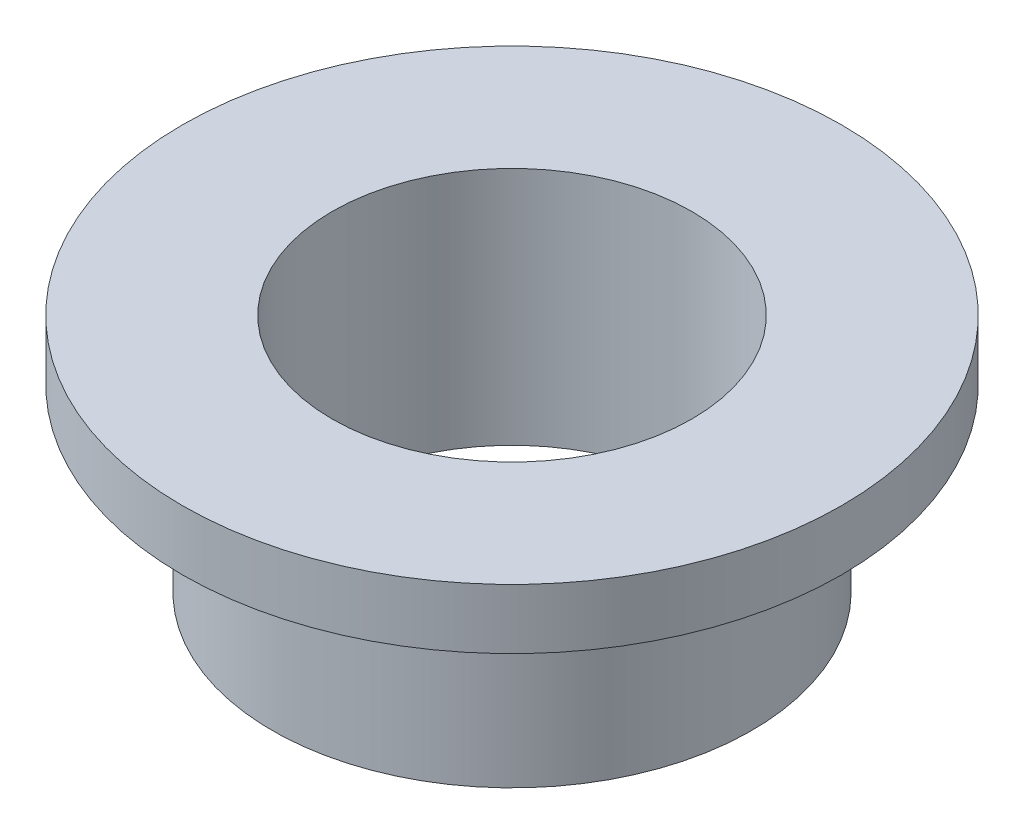
ISO-10303-21;
HEADER;
FILE_DESCRIPTION(('STEP AP214'),'2;1');
FILE_NAME('part.step','',(''),(''),'','','');
FILE_SCHEMA(('AUTOMOTIVE_DESIGN { 1 0 10303 214 1 1 1 1 }'));
ENDSEC;
DATA;
#1=APPLICATION_CONTEXT('core data for automotive mechanical design processes');
#2=APPLICATION_PROTOCOL_DEFINITION('international standard','automotive_design',2000,#1);
#3=PRODUCT_CONTEXT('',#1,'mechanical');
#4=PRODUCT('Part','Part','',(#3));
#5=PRODUCT_RELATED_PRODUCT_CATEGORY('part','',(#4));
#6=PRODUCT_DEFINITION_FORMATION('','',#4);
#7=PRODUCT_DEFINITION_CONTEXT('part definition',#1,'design');
#8=PRODUCT_DEFINITION('design','',#6,#7);
#9=PRODUCT_DEFINITION_SHAPE('','',#8);
#10=(LENGTH_UNIT() NAMED_UNIT(*) SI_UNIT(.MILLI.,.METRE.));
#11=(NAMED_UNIT(*) PLANE_ANGLE_UNIT() SI_UNIT($,.RADIAN.));
#12=(NAMED_UNIT(*) SI_UNIT($,.STERADIAN.) SOLID_ANGLE_UNIT());
#13=UNCERTAINTY_MEASURE_WITH_UNIT(LENGTH_MEASURE(1.E-05),#10,'distance_accuracy_value','');
#14=(GEOMETRIC_REPRESENTATION_CONTEXT(3) GLOBAL_UNCERTAINTY_ASSIGNED_CONTEXT((#13)) GLOBAL_UNIT_ASSIGNED_CONTEXT((#10,
#11,#12)) REPRESENTATION_CONTEXT('',''));
#15=CARTESIAN_POINT('',(0.,0.,0.));
#16=DIRECTION('',(0.,0.,1.));
#17=DIRECTION('',(1.,0.,0.));
#18=AXIS2_PLACEMENT_3D('',#15,#16,#17);
#19=CARTESIAN_POINT('',(0.,0.,0.));
#20=DIRECTION('',(0.,1.,0.));
#21=DIRECTION('',(0.,0.,1.));
#22=AXIS2_PLACEMENT_3D('',#19,#20,#21);
#23=PLANE('',#22);
#24=CARTESIAN_POINT('',(0.,0.,0.));
#25=DIRECTION('',(0.,1.,0.));
#26=DIRECTION('',(0.,0.,1.));
#27=AXIS2_PLACEMENT_3D('',#24,#25,#26);
#28=CIRCLE('',#27,6.35);
#29=CARTESIAN_POINT('',(0.,0.,-6.35));
#30=VERTEX_POINT('',#29);
#31=EDGE_CURVE('E35',#30,#30,#28,.T.);
#32=ORIENTED_EDGE('',*,*,#31,.F.);
#33=EDGE_LOOP('',(#32));
#34=FACE_BOUND('',#33,.T.);
#35=CARTESIAN_POINT('',(0.,0.,0.));
#36=DIRECTION('',(0.,1.,0.));
#37=DIRECTION('',(0.,0.,1.));
#38=AXIS2_PLACEMENT_3D('',#35,#36,#37);
#39=CIRCLE('',#38,4.7625);
#40=CARTESIAN_POINT('',(0.,0.,-4.7625));
#41=VERTEX_POINT('',#40);
#42=EDGE_CURVE('E42',#41,#41,#39,.T.);
#43=ORIENTED_EDGE('',*,*,#42,.T.);
#44=EDGE_LOOP('',(#43));
#45=FACE_BOUND('',#44,.T.);
#46=ADVANCED_FACE('F31',(#34,#45),#23,.F.);
#47=CARTESIAN_POINT('',(0.,4.7625,0.));
#48=DIRECTION('',(0.,-1.,0.));
#49=DIRECTION('',(0.,0.,-1.));
#50=AXIS2_PLACEMENT_3D('',#47,#48,#49);
#51=CYLINDRICAL_SURFACE('',#50,6.35);
#52=CARTESIAN_POINT('',(0.,4.7625,0.));
#53=DIRECTION('',(0.,1.,0.));
#54=DIRECTION('',(0.,0.,1.));
#55=AXIS2_PLACEMENT_3D('',#52,#53,#54);
#56=CIRCLE('',#55,6.35);
#57=CARTESIAN_POINT('',(0.,4.7625,-6.35));
#58=VERTEX_POINT('',#57);
#59=EDGE_CURVE('E10',#58,#58,#56,.T.);
#60=CARTESIAN_POINT('',(0.,4.7625,-6.35));
#61=CARTESIAN_POINT('',(0.,4.712890625,-6.35));
#62=CARTESIAN_POINT('',(0.,4.66328125,-6.35));
#63=CARTESIAN_POINT('',(0.,4.5640625,-6.35));
#64=CARTESIAN_POINT('',(0.,4.514453125,-6.35));
#65=CARTESIAN_POINT('',(0.,4.415234375,-6.35));
#66=CARTESIAN_POINT('',(0.,4.365625,-6.35));
#67=CARTESIAN_POINT('',(0.,4.26640625,-6.35));
#68=CARTESIAN_POINT('',(0.,4.216796875,-6.35));
#69=CARTESIAN_POINT('',(0.,4.117578125,-6.35));
#70=CARTESIAN_POINT('',(0.,4.06796875,-6.35));
#71=CARTESIAN_POINT('',(0.,3.96875,-6.35));
#72=CARTESIAN_POINT('',(0.,3.919140625,-6.35));
#73=CARTESIAN_POINT('',(0.,3.819921875,-6.35));
#74=CARTESIAN_POINT('',(0.,3.7703125,-6.35));
#75=CARTESIAN_POINT('',(0.,3.67109375,-6.35));
#76=CARTESIAN_POINT('',(0.,3.621484375,-6.35));
#77=CARTESIAN_POINT('',(0.,3.522265625,-6.35));
#78=CARTESIAN_POINT('',(0.,3.47265625,-6.35));
#79=CARTESIAN_POINT('',(0.,3.3734375,-6.35));
#80=CARTESIAN_POINT('',(0.,3.323828125,-6.35));
#81=CARTESIAN_POINT('',(0.,3.224609375,-6.35));
#82=CARTESIAN_POINT('',(0.,3.175,-6.35));
#83=CARTESIAN_POINT('',(0.,3.07578125,-6.35));
#84=CARTESIAN_POINT('',(0.,3.026171875,-6.35));
#85=CARTESIAN_POINT('',(0.,2.926953125,-6.35));
#86=CARTESIAN_POINT('',(0.,2.87734375,-6.35));
#87=CARTESIAN_POINT('',(0.,2.778125,-6.35));
#88=CARTESIAN_POINT('',(0.,2.728515625,-6.35));
#89=CARTESIAN_POINT('',(0.,2.629296875,-6.35));
#90=CARTESIAN_POINT('',(0.,2.5796875,-6.35));
#91=CARTESIAN_POINT('',(0.,2.48046875,-6.35));
#92=CARTESIAN_POINT('',(0.,2.430859375,-6.35));
#93=CARTESIAN_POINT('',(0.,2.331640625,-6.35));
#94=CARTESIAN_POINT('',(0.,2.28203125,-6.35));
#95=CARTESIAN_POINT('',(0.,2.1828125,-6.35));
#96=CARTESIAN_POINT('',(0.,2.133203125,-6.35));
#97=CARTESIAN_POINT('',(0.,2.033984375,-6.35));
#98=CARTESIAN_POINT('',(0.,1.984375,-6.35));
#99=CARTESIAN_POINT('',(0.,1.88515625,-6.35));
#100=CARTESIAN_POINT('',(0.,1.835546875,-6.35));
#101=CARTESIAN_POINT('',(0.,1.736328125,-6.35));
#102=CARTESIAN_POINT('',(0.,1.68671875,-6.35));
#103=CARTESIAN_POINT('',(0.,1.5875,-6.35));
#104=CARTESIAN_POINT('',(0.,1.537890625,-6.35));
#105=CARTESIAN_POINT('',(0.,1.438671875,-6.35));
#106=CARTESIAN_POINT('',(0.,1.3890625,-6.35));
#107=CARTESIAN_POINT('',(0.,1.28984375,-6.35));
#108=CARTESIAN_POINT('',(0.,1.240234375,-6.35));
#109=CARTESIAN_POINT('',(0.,1.141015625,-6.35));
#110=CARTESIAN_POINT('',(0.,1.09140625,-6.35));
#111=CARTESIAN_POINT('',(0.,0.992187499999999,-6.35));
#112=CARTESIAN_POINT('',(0.,0.942578124999999,-6.35));
#113=CARTESIAN_POINT('',(0.,0.843359375,-6.35));
#114=CARTESIAN_POINT('',(0.,0.79375,-6.35));
#115=CARTESIAN_POINT('',(0.,0.69453125,-6.35));
#116=CARTESIAN_POINT('',(0.,0.644921875,-6.35));
#117=CARTESIAN_POINT('',(0.,0.545703125,-6.35));
#118=CARTESIAN_POINT('',(0.,0.49609375,-6.35));
#119=CARTESIAN_POINT('',(0.,0.396875,-6.35));
#120=CARTESIAN_POINT('',(0.,0.347265625,-6.35));
#121=CARTESIAN_POINT('',(0.,0.248046875,-6.35));
#122=CARTESIAN_POINT('',(0.,0.1984375,-6.35));
#123=CARTESIAN_POINT('',(0.,0.09921875,-6.35));
#124=CARTESIAN_POINT('',(0.,0.049609375,-6.35));
#125=CARTESIAN_POINT('',(0.,0.,-6.35));
#126=B_SPLINE_CURVE_WITH_KNOTS('',3,(#60,#61,#62,#63,#64,#65,#66,#67,#68,#69,#70,#71,#72,#73,
#74,#75,#76,#77,#78,#79,#80,#81,#82,#83,#84,#85,#86,#87,#88,#89,#90,#91,#92,#93,#94,#95,#96,#97,
#98,#99,#100,#101,#102,#103,#104,#105,#106,#107,#108,#109,#110,#111,#112,#113,#114,#115,#116,
#117,#118,#119,#120,#121,#122,#123,#124,#125),.UNSPECIFIED.,.F.,.F.,(4,2,2,2,2,2,2,2,2,2,2,2,2,
2,2,2,2,2,2,2,2,2,2,2,2,2,2,2,2,2,2,2,4),(0.,0.148828125,0.29765625,0.446484375,0.5953125,
0.744140625,0.892968750000001,1.041796875,1.190625,1.339453125,1.48828125,1.637109375,1.7859375,
1.934765625,2.08359375,2.232421875,2.38125,2.530078125,2.67890625,2.827734375,2.9765625,
3.125390625,3.27421875,3.423046875,3.571875,3.720703125,3.86953125,4.018359375,4.1671875,
4.316015625,4.46484375,4.613671875,4.7625),.UNSPECIFIED.);
#127=EDGE_CURVE('BSEAM33',#58,#30,#126,.T.);
#128=ORIENTED_EDGE('',*,*,#59,.F.);
#129=ORIENTED_EDGE('',*,*,#31,.T.);
#130=ORIENTED_EDGE('',*,*,#127,.T.);
#131=ORIENTED_EDGE('',*,*,#127,.F.);
#132=EDGE_LOOP('',(#128,#130,#129,#131));
#133=FACE_BOUND('',#132,.T.);
#134=ADVANCED_FACE('F33',(#133),#51,.T.);
#135=CARTESIAN_POINT('',(0.,4.7625,0.));
#136=DIRECTION('',(0.,-1.,0.));
#137=DIRECTION('',(0.,0.,-1.));
#138=AXIS2_PLACEMENT_3D('',#135,#136,#137);
#139=CYLINDRICAL_SURFACE('',#138,4.7625);
#140=CARTESIAN_POINT('',(0.,6.35,0.));
#141=DIRECTION('',(0.,1.,0.));
#142=DIRECTION('',(0.,0.,1.));
#143=AXIS2_PLACEMENT_3D('',#140,#141,#142);
#144=CIRCLE('',#143,4.7625);
#145=CARTESIAN_POINT('',(0.,6.35,-4.7625));
#146=VERTEX_POINT('',#145);
#147=EDGE_CURVE('E50',#146,#146,#144,.T.);
#148=CARTESIAN_POINT('',(0.,0.,-4.7625));
#149=CARTESIAN_POINT('',(0.,0.0661458333333333,-4.7625));
#150=CARTESIAN_POINT('',(0.,0.132291666666667,-4.7625));
#151=CARTESIAN_POINT('',(0.,0.264583333333333,-4.7625));
#152=CARTESIAN_POINT('',(0.,0.330729166666666,-4.7625));
#153=CARTESIAN_POINT('',(0.,0.463020833333333,-4.7625));
#154=CARTESIAN_POINT('',(0.,0.529166666666667,-4.7625));
#155=CARTESIAN_POINT('',(0.,0.661458333333334,-4.7625));
#156=CARTESIAN_POINT('',(0.,0.727604166666667,-4.7625));
#157=CARTESIAN_POINT('',(0.,0.859895833333333,-4.7625));
#158=CARTESIAN_POINT('',(0.,0.926041666666666,-4.7625));
#159=CARTESIAN_POINT('',(0.,1.05833333333333,-4.7625));
#160=CARTESIAN_POINT('',(0.,1.12447916666667,-4.7625));
#161=CARTESIAN_POINT('',(0.,1.25677083333333,-4.7625));
#162=CARTESIAN_POINT('',(0.,1.32291666666667,-4.7625));
#163=CARTESIAN_POINT('',(0.,1.45520833333333,-4.7625));
#164=CARTESIAN_POINT('',(0.,1.52135416666667,-4.7625));
#165=CARTESIAN_POINT('',(0.,1.65364583333333,-4.7625));
#166=CARTESIAN_POINT('',(0.,1.71979166666667,-4.7625));
#167=CARTESIAN_POINT('',(0.,1.85208333333333,-4.7625));
#168=CARTESIAN_POINT('',(0.,1.91822916666667,-4.7625));
#169=CARTESIAN_POINT('',(0.,2.05052083333333,-4.7625));
#170=CARTESIAN_POINT('',(0.,2.11666666666667,-4.7625));
#171=CARTESIAN_POINT('',(0.,2.24895833333333,-4.7625));
#172=CARTESIAN_POINT('',(0.,2.31510416666667,-4.7625));
#173=CARTESIAN_POINT('',(0.,2.44739583333333,-4.7625));
#174=CARTESIAN_POINT('',(0.,2.51354166666667,-4.7625));
#175=CARTESIAN_POINT('',(0.,2.64583333333333,-4.7625));
#176=CARTESIAN_POINT('',(0.,2.71197916666667,-4.7625));
#177=CARTESIAN_POINT('',(0.,2.84427083333333,-4.7625));
#178=CARTESIAN_POINT('',(0.,2.91041666666667,-4.7625));
#179=CARTESIAN_POINT('',(0.,3.04270833333333,-4.7625));
#180=CARTESIAN_POINT('',(0.,3.10885416666667,-4.7625));
#181=CARTESIAN_POINT('',(0.,3.24114583333333,-4.7625));
#182=CARTESIAN_POINT('',(0.,3.30729166666667,-4.7625));
#183=CARTESIAN_POINT('',(0.,3.43958333333333,-4.7625));
#184=CARTESIAN_POINT('',(0.,3.50572916666667,-4.7625));
#185=CARTESIAN_POINT('',(0.,3.63802083333333,-4.7625));
#186=CARTESIAN_POINT('',(0.,3.70416666666667,-4.7625));
#187=CARTESIAN_POINT('',(0.,3.83645833333333,-4.7625));
#188=CARTESIAN_POINT('',(0.,3.90260416666667,-4.7625));
#189=CARTESIAN_POINT('',(0.,4.03489583333333,-4.7625));
#190=CARTESIAN_POINT('',(0.,4.10104166666667,-4.7625));
#191=CARTESIAN_POINT('',(0.,4.23333333333333,-4.7625));
#192=CARTESIAN_POINT('',(0.,4.29947916666667,-4.7625));
#193=CARTESIAN_POINT('',(0.,4.43177083333333,-4.7625));
#194=CARTESIAN_POINT('',(0.,4.49791666666667,-4.7625));
#195=CARTESIAN_POINT('',(0.,4.63020833333333,-4.7625));
#196=CARTESIAN_POINT('',(0.,4.69635416666667,-4.7625));
#197=CARTESIAN_POINT('',(0.,4.82864583333333,-4.7625));
#198=CARTESIAN_POINT('',(0.,4.89479166666667,-4.7625));
#199=CARTESIAN_POINT('',(0.,5.02708333333333,-4.7625));
#200=CARTESIAN_POINT('',(0.,5.09322916666667,-4.7625));
#201=CARTESIAN_POINT('',(0.,5.22552083333333,-4.7625));
#202=CARTESIAN_POINT('',(0.,5.29166666666667,-4.7625));
#203=CARTESIAN_POINT('',(0.,5.42395833333333,-4.7625));
#204=CARTESIAN_POINT('',(0.,5.49010416666667,-4.7625));
#205=CARTESIAN_POINT('',(0.,5.62239583333333,-4.7625));
#206=CARTESIAN_POINT('',(0.,5.68854166666667,-4.7625));
#207=CARTESIAN_POINT('',(0.,5.82083333333333,-4.7625));
#208=CARTESIAN_POINT('',(0.,5.88697916666667,-4.7625));
#209=CARTESIAN_POINT('',(0.,6.01927083333333,-4.7625));
#210=CARTESIAN_POINT('',(0.,6.08541666666667,-4.7625));
#211=CARTESIAN_POINT('',(0.,6.21770833333333,-4.7625));
#212=CARTESIAN_POINT('',(0.,6.28385416666667,-4.7625));
#213=CARTESIAN_POINT('',(0.,6.35,-4.7625));
#214=B_SPLINE_CURVE_WITH_KNOTS('',3,(#148,#149,#150,#151,#152,#153,#154,#155,#156,#157,#158,
#159,#160,#161,#162,#163,#164,#165,#166,#167,#168,#169,#170,#171,#172,#173,#174,#175,#176,#177,
#178,#179,#180,#181,#182,#183,#184,#185,#186,#187,#188,#189,#190,#191,#192,#193,#194,#195,#196,
#197,#198,#199,#200,#201,#202,#203,#204,#205,#206,#207,#208,#209,#210,#211,#212,#213),
.UNSPECIFIED.,.F.,.F.,(4,2,2,2,2,2,2,2,2,2,2,2,2,2,2,2,2,2,2,2,2,2,2,2,2,2,2,2,2,2,2,2,4),(0.,
0.1984375,0.396875,0.5953125,0.79375,0.9921875,1.190625,1.3890625,1.5875,1.7859375,1.984375,
2.1828125,2.38125,2.5796875,2.778125,2.9765625,3.175,3.3734375,3.571875,3.7703125,3.96875,
4.1671875,4.365625,4.5640625,4.7625,4.9609375,5.159375,5.3578125,5.55625,5.7546875,5.953125,
6.1515625,6.35),.UNSPECIFIED.);
#215=EDGE_CURVE('BSEAM56',#41,#146,#214,.T.);
#216=ORIENTED_EDGE('',*,*,#42,.F.);
#217=ORIENTED_EDGE('',*,*,#147,.T.);
#218=ORIENTED_EDGE('',*,*,#215,.T.);
#219=ORIENTED_EDGE('',*,*,#215,.F.);
#220=EDGE_LOOP('',(#216,#218,#217,#219));
#221=FACE_BOUND('',#220,.T.);
#222=ADVANCED_FACE('F56',(#221),#139,.F.);
#223=CARTESIAN_POINT('',(0.,4.7625,0.));
#224=DIRECTION('',(0.,1.,0.));
#225=DIRECTION('',(0.,0.,1.));
#226=AXIS2_PLACEMENT_3D('',#223,#224,#225);
#227=PLANE('',#226);
#228=CARTESIAN_POINT('',(0.,4.7625,0.));
#229=DIRECTION('',(0.,1.,0.));
#230=DIRECTION('',(0.,0.,1.));
#231=AXIS2_PLACEMENT_3D('',#228,#229,#230);
#232=CIRCLE('',#231,8.73125);
#233=CARTESIAN_POINT('',(0.,4.7625,8.73125));
#234=VERTEX_POINT('',#233);
#235=EDGE_CURVE('E47',#234,#234,#232,.T.);
#236=ORIENTED_EDGE('',*,*,#235,.F.);
#237=EDGE_LOOP('',(#236));
#238=FACE_BOUND('',#237,.T.);
#239=ORIENTED_EDGE('',*,*,#59,.T.);
#240=EDGE_LOOP('',(#239));
#241=FACE_BOUND('',#240,.T.);
#242=ADVANCED_FACE('F61',(#238,#241),#227,.F.);
#243=CARTESIAN_POINT('',(0.,6.35,0.));
#244=DIRECTION('',(0.,1.,0.));
#245=DIRECTION('',(0.,0.,1.));
#246=AXIS2_PLACEMENT_3D('',#243,#244,#245);
#247=PLANE('',#246);
#248=CARTESIAN_POINT('',(0.,6.35,0.));
#249=DIRECTION('',(0.,1.,0.));
#250=DIRECTION('',(0.,0.,1.));
#251=AXIS2_PLACEMENT_3D('',#248,#249,#250);
#252=CIRCLE('',#251,8.73125);
#253=CARTESIAN_POINT('',(0.,6.35,8.73125));
#254=VERTEX_POINT('',#253);
#255=EDGE_CURVE('E46',#254,#254,#252,.T.);
#256=ORIENTED_EDGE('',*,*,#255,.T.);
#257=EDGE_LOOP('',(#256));
#258=FACE_BOUND('',#257,.T.);
#259=ORIENTED_EDGE('',*,*,#147,.F.);
#260=EDGE_LOOP('',(#259));
#261=FACE_BOUND('',#260,.T.);
#262=ADVANCED_FACE('F58',(#258,#261),#247,.T.);
#263=CARTESIAN_POINT('',(0.,6.35,0.));
#264=DIRECTION('',(0.,-1.,0.));
#265=DIRECTION('',(0.,0.,-1.));
#266=AXIS2_PLACEMENT_3D('',#263,#264,#265);
#267=CYLINDRICAL_SURFACE('',#266,8.73125);
#268=ORIENTED_EDGE('',*,*,#255,.F.);
#269=EDGE_LOOP('',(#268));
#270=FACE_BOUND('',#269,.T.);
#271=ORIENTED_EDGE('',*,*,#235,.T.);
#272=EDGE_LOOP('',(#271));
#273=FACE_BOUND('',#272,.T.);
#274=ADVANCED_FACE('F60',(#270,#273),#267,.T.);
#275=CLOSED_SHELL('',(#46,#134,#222,#242,#262,#274));
#276=MANIFOLD_SOLID_BREP('B2',#275);
#277=ADVANCED_BREP_SHAPE_REPRESENTATION('',(#18,#276),#14);
#278=SHAPE_DEFINITION_REPRESENTATION(#9,#277);
ENDSEC;
END-ISO-10303-21;
